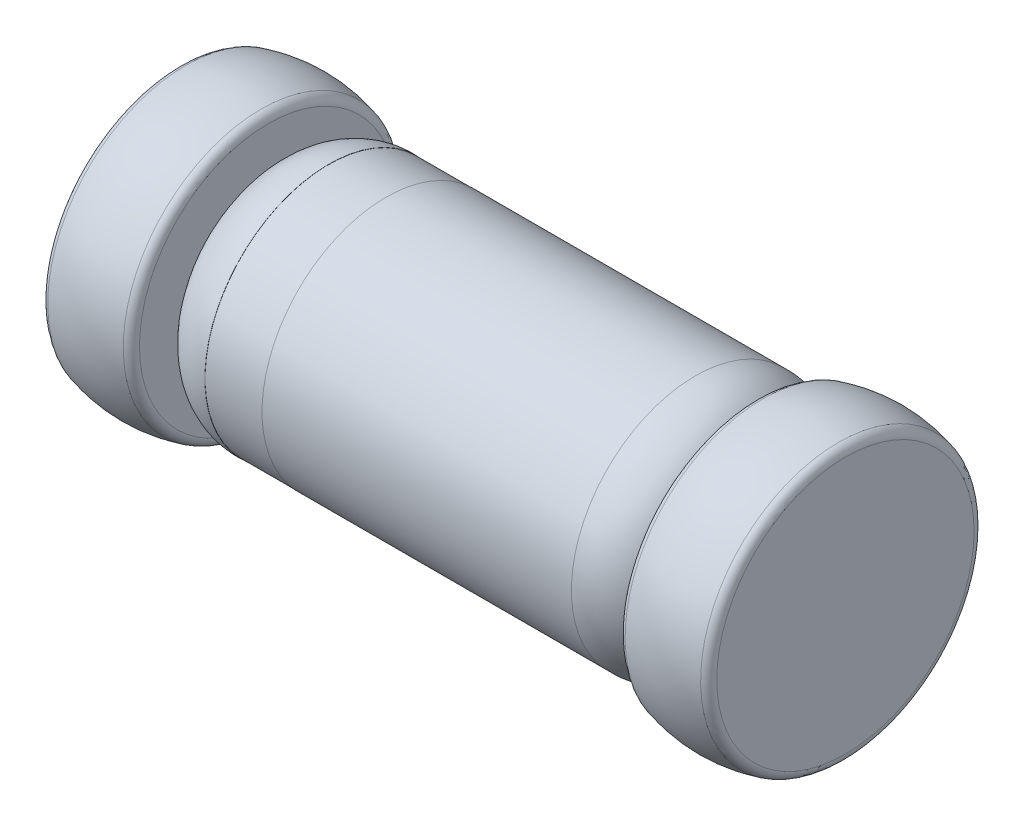
ISO-10303-21;
HEADER;
FILE_DESCRIPTION(('STEP AP214'),'2;1');
FILE_NAME('part.step','',(''),(''),'','','');
FILE_SCHEMA(('AUTOMOTIVE_DESIGN { 1 0 10303 214 1 1 1 1 }'));
ENDSEC;
DATA;
#1=APPLICATION_CONTEXT('core data for automotive mechanical design processes');
#2=APPLICATION_PROTOCOL_DEFINITION('international standard','automotive_design',2000,#1);
#3=PRODUCT_CONTEXT('',#1,'mechanical');
#4=PRODUCT('Part','Part','',(#3));
#5=PRODUCT_RELATED_PRODUCT_CATEGORY('part','',(#4));
#6=PRODUCT_DEFINITION_FORMATION('','',#4);
#7=PRODUCT_DEFINITION_CONTEXT('part definition',#1,'design');
#8=PRODUCT_DEFINITION('design','',#6,#7);
#9=PRODUCT_DEFINITION_SHAPE('','',#8);
#10=(LENGTH_UNIT() NAMED_UNIT(*) SI_UNIT(.MILLI.,.METRE.));
#11=(NAMED_UNIT(*) PLANE_ANGLE_UNIT() SI_UNIT($,.RADIAN.));
#12=(NAMED_UNIT(*) SI_UNIT($,.STERADIAN.) SOLID_ANGLE_UNIT());
#13=UNCERTAINTY_MEASURE_WITH_UNIT(LENGTH_MEASURE(1.E-05),#10,'distance_accuracy_value','');
#14=(GEOMETRIC_REPRESENTATION_CONTEXT(3) GLOBAL_UNCERTAINTY_ASSIGNED_CONTEXT((#13)) GLOBAL_UNIT_ASSIGNED_CONTEXT((#10,
#11,#12)) REPRESENTATION_CONTEXT('',''));
#15=CARTESIAN_POINT('',(0.,0.,0.));
#16=DIRECTION('',(0.,0.,1.));
#17=DIRECTION('',(1.,0.,0.));
#18=AXIS2_PLACEMENT_3D('',#15,#16,#17);
#19=CARTESIAN_POINT('',(-1.33,0.75,0.));
#20=DIRECTION('',(1.,0.,0.));
#21=DIRECTION('',(0.,0.,-1.));
#22=AXIS2_PLACEMENT_3D('',#19,#20,#21);
#23=TOROIDAL_SURFACE('',#22,0.675111101967669,0.0499999999999999);
#24=CARTESIAN_POINT('',(-1.31678571428571,0.75,0.));
#25=DIRECTION('',(1.,0.,0.));
#26=DIRECTION('',(0.,0.,-1.));
#27=AXIS2_PLACEMENT_3D('',#24,#25,#26);
#28=CIRCLE('',#27,0.723333323536788);
#29=CARTESIAN_POINT('',(-1.31678571428571,1.47333332353679,0.));
#30=VERTEX_POINT('',#29);
#31=EDGE_CURVE('E83',#30,#30,#28,.T.);
#32=ORIENTED_EDGE('',*,*,#31,.T.);
#33=EDGE_LOOP('',(#32));
#34=FACE_BOUND('',#33,.T.);
#35=CARTESIAN_POINT('',(-1.28,0.75,0.));
#36=DIRECTION('',(1.,0.,0.));
#37=DIRECTION('',(0.,0.,-1.));
#38=AXIS2_PLACEMENT_3D('',#35,#36,#37);
#39=CIRCLE('',#38,0.675111101967669);
#40=CARTESIAN_POINT('',(-1.28,0.75,-0.675111101967669));
#41=VERTEX_POINT('',#40);
#42=EDGE_CURVE('E10',#41,#41,#39,.T.);
#43=ORIENTED_EDGE('',*,*,#42,.F.);
#44=EDGE_LOOP('',(#43));
#45=FACE_BOUND('',#44,.T.);
#46=ADVANCED_FACE('F34',(#34,#45),#23,.T.);
#47=CARTESIAN_POINT('',(-1.28,1.42511110196767,0.));
#48=DIRECTION('',(1.,0.,0.));
#49=DIRECTION('',(0.,0.,-1.));
#50=AXIS2_PLACEMENT_3D('',#47,#48,#49);
#51=PLANE('',#50);
#52=ORIENTED_EDGE('',*,*,#42,.T.);
#53=EDGE_LOOP('',(#52));
#54=FACE_BOUND('',#53,.T.);
#55=CARTESIAN_POINT('',(-1.28,0.75,0.));
#56=DIRECTION('',(1.,0.,0.));
#57=DIRECTION('',(0.,0.,-1.));
#58=AXIS2_PLACEMENT_3D('',#55,#56,#57);
#59=CIRCLE('',#58,0.349999999999998);
#60=CARTESIAN_POINT('',(-1.28,0.75,-0.349999999999998));
#61=VERTEX_POINT('',#60);
#62=EDGE_CURVE('E40',#61,#61,#59,.T.);
#63=ORIENTED_EDGE('',*,*,#62,.F.);
#64=EDGE_LOOP('',(#63));
#65=FACE_BOUND('',#64,.T.);
#66=ADVANCED_FACE('F101',(#54,#65),#51,.T.);
#67=CARTESIAN_POINT('',(-0.980000507994012,0.75,0.));
#68=DIRECTION('',(1.,0.,0.));
#69=DIRECTION('',(0.,0.,-1.));
#70=AXIS2_PLACEMENT_3D('',#67,#68,#69);
#71=TOROIDAL_SURFACE('',#70,0.350552083462148,0.3);
#72=ORIENTED_EDGE('',*,*,#62,.T.);
#73=EDGE_LOOP('',(#72));
#74=FACE_BOUND('',#73,.T.);
#75=CARTESIAN_POINT('',(-0.961808606467793,0.75,0.));
#76=DIRECTION('',(1.,0.,0.));
#77=DIRECTION('',(0.,0.,-1.));
#78=AXIS2_PLACEMENT_3D('',#75,#76,#77);
#79=CIRCLE('',#78,0.65);
#80=CARTESIAN_POINT('',(-0.961808606467793,0.75,-0.65));
#81=VERTEX_POINT('',#80);
#82=EDGE_CURVE('E44',#81,#81,#79,.T.);
#83=ORIENTED_EDGE('',*,*,#82,.F.);
#84=EDGE_LOOP('',(#83));
#85=FACE_BOUND('',#84,.T.);
#86=ADVANCED_FACE('F105',(#74,#85),#71,.T.);
#87=CARTESIAN_POINT('',(-0.961808606467793,1.4,0.));
#88=DIRECTION('',(1.,0.,0.));
#89=DIRECTION('',(0.,0.,-1.));
#90=AXIS2_PLACEMENT_3D('',#87,#88,#89);
#91=PLANE('',#90);
#92=ORIENTED_EDGE('',*,*,#82,.T.);
#93=EDGE_LOOP('',(#92));
#94=FACE_BOUND('',#93,.T.);
#95=CARTESIAN_POINT('',(-0.961808606467793,0.75,0.));
#96=DIRECTION('',(1.,0.,0.));
#97=DIRECTION('',(0.,0.,-1.));
#98=AXIS2_PLACEMENT_3D('',#95,#96,#97);
#99=CIRCLE('',#98,0.649);
#100=CARTESIAN_POINT('',(-0.961808606467793,0.75,-0.649));
#101=VERTEX_POINT('',#100);
#102=EDGE_CURVE('E48',#101,#101,#99,.T.);
#103=ORIENTED_EDGE('',*,*,#102,.F.);
#104=EDGE_LOOP('',(#103));
#105=FACE_BOUND('',#104,.T.);
#106=ADVANCED_FACE('F109',(#94,#105),#91,.T.);
#107=CARTESIAN_POINT('',(1.75,0.75,0.));
#108=DIRECTION('',(1.,0.,0.));
#109=DIRECTION('',(0.,0.,-1.));
#110=AXIS2_PLACEMENT_3D('',#107,#108,#109);
#111=CYLINDRICAL_SURFACE('',#110,0.649);
#112=ORIENTED_EDGE('',*,*,#102,.T.);
#113=EDGE_LOOP('',(#112));
#114=FACE_BOUND('',#113,.T.);
#115=CARTESIAN_POINT('',(-0.661808606467793,0.75,0.));
#116=DIRECTION('',(1.,0.,0.));
#117=DIRECTION('',(0.,0.,-1.));
#118=AXIS2_PLACEMENT_3D('',#115,#116,#117);
#119=CIRCLE('',#118,0.649);
#120=CARTESIAN_POINT('',(-0.661808606467793,0.75,-0.649));
#121=VERTEX_POINT('',#120);
#122=EDGE_CURVE('E53',#121,#121,#119,.T.);
#123=ORIENTED_EDGE('',*,*,#122,.F.);
#124=EDGE_LOOP('',(#123));
#125=FACE_BOUND('',#124,.T.);
#126=ADVANCED_FACE('F115',(#114,#125),#111,.T.);
#127=CARTESIAN_POINT('',(-0.661808606467793,1.399,0.));
#128=DIRECTION('',(-1.,0.,0.));
#129=DIRECTION('',(0.,0.,1.));
#130=AXIS2_PLACEMENT_3D('',#127,#128,#129);
#131=PLANE('',#130);
#132=ORIENTED_EDGE('',*,*,#122,.T.);
#133=EDGE_LOOP('',(#132));
#134=FACE_BOUND('',#133,.T.);
#135=CARTESIAN_POINT('',(-0.661808606467793,0.75,0.));
#136=DIRECTION('',(1.,0.,0.));
#137=DIRECTION('',(0.,0.,-1.));
#138=AXIS2_PLACEMENT_3D('',#135,#136,#137);
#139=CIRCLE('',#138,0.65);
#140=CARTESIAN_POINT('',(-0.661808606467793,0.75,-0.65));
#141=VERTEX_POINT('',#140);
#142=EDGE_CURVE('E56',#141,#141,#139,.T.);
#143=ORIENTED_EDGE('',*,*,#142,.F.);
#144=EDGE_LOOP('',(#143));
#145=FACE_BOUND('',#144,.T.);
#146=ADVANCED_FACE('F119',(#134,#145),#131,.T.);
#147=CARTESIAN_POINT('',(1.75,0.75,0.));
#148=DIRECTION('',(1.,0.,0.));
#149=DIRECTION('',(0.,0.,-1.));
#150=AXIS2_PLACEMENT_3D('',#147,#148,#149);
#151=CYLINDRICAL_SURFACE('',#150,0.65);
#152=ORIENTED_EDGE('',*,*,#142,.T.);
#153=EDGE_LOOP('',(#152));
#154=FACE_BOUND('',#153,.T.);
#155=CARTESIAN_POINT('',(0.961808606467793,0.75,0.));
#156=DIRECTION('',(1.,0.,0.));
#157=DIRECTION('',(0.,0.,-1.));
#158=AXIS2_PLACEMENT_3D('',#155,#156,#157);
#159=CIRCLE('',#158,0.65);
#160=CARTESIAN_POINT('',(0.961808606467793,0.75,-0.65));
#161=VERTEX_POINT('',#160);
#162=EDGE_CURVE('E59',#161,#161,#159,.T.);
#163=ORIENTED_EDGE('',*,*,#162,.F.);
#164=EDGE_LOOP('',(#163));
#165=FACE_BOUND('',#164,.T.);
#166=ADVANCED_FACE('F123',(#154,#165),#151,.T.);
#167=CARTESIAN_POINT('',(0.980000507994012,0.75,0.));
#168=DIRECTION('',(1.,0.,0.));
#169=DIRECTION('',(0.,0.,-1.));
#170=AXIS2_PLACEMENT_3D('',#167,#168,#169);
#171=TOROIDAL_SURFACE('',#170,0.350552083462148,0.3);
#172=ORIENTED_EDGE('',*,*,#162,.T.);
#173=EDGE_LOOP('',(#172));
#174=FACE_BOUND('',#173,.T.);
#175=CARTESIAN_POINT('',(1.28,0.75,0.));
#176=DIRECTION('',(1.,0.,0.));
#177=DIRECTION('',(0.,0.,-1.));
#178=AXIS2_PLACEMENT_3D('',#175,#176,#177);
#179=CIRCLE('',#178,0.349999999999998);
#180=CARTESIAN_POINT('',(1.28,0.75,-0.349999999999998));
#181=VERTEX_POINT('',#180);
#182=EDGE_CURVE('E62',#181,#181,#179,.T.);
#183=ORIENTED_EDGE('',*,*,#182,.F.);
#184=EDGE_LOOP('',(#183));
#185=FACE_BOUND('',#184,.T.);
#186=ADVANCED_FACE('F127',(#174,#185),#171,.T.);
#187=CARTESIAN_POINT('',(1.28,1.42511110196767,0.));
#188=DIRECTION('',(-1.,0.,0.));
#189=DIRECTION('',(0.,0.,1.));
#190=AXIS2_PLACEMENT_3D('',#187,#188,#189);
#191=PLANE('',#190);
#192=ORIENTED_EDGE('',*,*,#182,.T.);
#193=EDGE_LOOP('',(#192));
#194=FACE_BOUND('',#193,.T.);
#195=CARTESIAN_POINT('',(1.28,0.75,0.));
#196=DIRECTION('',(1.,0.,0.));
#197=DIRECTION('',(0.,0.,-1.));
#198=AXIS2_PLACEMENT_3D('',#195,#196,#197);
#199=CIRCLE('',#198,0.675111101967669);
#200=CARTESIAN_POINT('',(1.28,0.75,-0.675111101967669));
#201=VERTEX_POINT('',#200);
#202=EDGE_CURVE('E65',#201,#201,#199,.T.);
#203=ORIENTED_EDGE('',*,*,#202,.F.);
#204=EDGE_LOOP('',(#203));
#205=FACE_BOUND('',#204,.T.);
#206=ADVANCED_FACE('F131',(#194,#205),#191,.T.);
#207=CARTESIAN_POINT('',(1.33,0.75,0.));
#208=DIRECTION('',(1.,0.,0.));
#209=DIRECTION('',(0.,0.,-1.));
#210=AXIS2_PLACEMENT_3D('',#207,#208,#209);
#211=TOROIDAL_SURFACE('',#210,0.675111101967669,0.0499999999999999);
#212=ORIENTED_EDGE('',*,*,#202,.T.);
#213=EDGE_LOOP('',(#212));
#214=FACE_BOUND('',#213,.T.);
#215=CARTESIAN_POINT('',(1.31678571428571,0.75,0.));
#216=DIRECTION('',(1.,0.,0.));
#217=DIRECTION('',(0.,0.,-1.));
#218=AXIS2_PLACEMENT_3D('',#215,#216,#217);
#219=CIRCLE('',#218,0.723333323536788);
#220=CARTESIAN_POINT('',(1.31678571428571,1.47333332353679,0.));
#221=VERTEX_POINT('',#220);
#222=EDGE_CURVE('E68',#221,#221,#219,.T.);
#223=ORIENTED_EDGE('',*,*,#222,.F.);
#224=EDGE_LOOP('',(#223));
#225=FACE_BOUND('',#224,.T.);
#226=ADVANCED_FACE('F135',(#214,#225),#211,.T.);
#227=CARTESIAN_POINT('',(1.515,0.75,0.));
#228=DIRECTION('',(1.,0.,0.));
#229=DIRECTION('',(0.,1.,0.));
#230=AXIS2_PLACEMENT_3D('',#227,#228,#229);
#231=SPHERICAL_SURFACE('',#230,0.75);
#232=CARTESIAN_POINT('',(1.71321428571429,0.75,0.));
#233=DIRECTION('',(1.,0.,0.));
#234=DIRECTION('',(0.,0.,-1.));
#235=AXIS2_PLACEMENT_3D('',#232,#233,#234);
#236=CIRCLE('',#235,0.723333323536788);
#237=CARTESIAN_POINT('',(1.71321428571429,1.47333332353679,0.));
#238=VERTEX_POINT('',#237);
#239=EDGE_CURVE('E71',#238,#238,#236,.T.);
#240=CARTESIAN_POINT('',(1.31678571428571,1.47333332353679,0.));
#241=CARTESIAN_POINT('',(1.32081623561858,1.47443780678074,0.));
#242=CARTESIAN_POINT('',(1.32485599016493,1.47550859534375,0.));
#243=CARTESIAN_POINT('',(1.33295283302281,1.477582498808,0.));
#244=CARTESIAN_POINT('',(1.33700992133435,1.47858561370924,0.));
#245=CARTESIAN_POINT('',(1.34514029906079,1.4805238855501,0.));
#246=CARTESIAN_POINT('',(1.3492135884757,1.48145904248971,0.));
#247=CARTESIAN_POINT('',(1.35737522992211,1.48326113816415,0.));
#248=CARTESIAN_POINT('',(1.36146358195362,1.48412807689896,0.));
#249=CARTESIAN_POINT('',(1.36965420628522,1.48579349362538,0.));
#250=CARTESIAN_POINT('',(1.37375647858531,1.48659197161698,0.));
#251=CARTESIAN_POINT('',(1.3819737971231,1.48812024381253,0.));
#252=CARTESIAN_POINT('',(1.38608884336079,1.48885003801649,0.));
#253=CARTESIAN_POINT('',(1.3943305598983,1.49024073868738,0.));
#254=CARTESIAN_POINT('',(1.39845723019812,1.49090164515433,0.));
#255=CARTESIAN_POINT('',(1.40672104172956,1.49215438567747,0.));
#256=CARTESIAN_POINT('',(1.41085818296118,1.49274621973368,0.));
#257=CARTESIAN_POINT('',(1.41914178030178,1.49386065005577,0.));
#258=CARTESIAN_POINT('',(1.42328823641075,1.49438324632164,0.));
#259=CARTESIAN_POINT('',(1.43158930484824,1.49535905503269,0.));
#260=CARTESIAN_POINT('',(1.43574391717676,1.49581226747786,0.));
#261=CARTESIAN_POINT('',(1.44406013711651,1.49664918190476,0.));
#262=CARTESIAN_POINT('',(1.44822174472775,1.49703288388648,0.));
#263=CARTESIAN_POINT('',(1.4565507923414,1.49773067016743,0.));
#264=CARTESIAN_POINT('',(1.46071823234381,1.49804475446666,0.));
#265=CARTESIAN_POINT('',(1.46905778021848,1.49860321761699,0.));
#266=CARTESIAN_POINT('',(1.47322988809075,1.4988475964681,0.));
#267=CARTESIAN_POINT('',(1.48157760587947,1.49926658043464,0.));
#268=CARTESIAN_POINT('',(1.48575321579592,1.49944118555006,0.));
#269=CARTESIAN_POINT('',(1.49410677086875,1.49972057325475,0.));
#270=CARTESIAN_POINT('',(1.49828471602513,1.49982535584401,0.));
#271=CARTESIAN_POINT('',(1.506641774121,1.49996506921664,0.));
#272=CARTESIAN_POINT('',(1.5108208870605,1.5,0.));
#273=CARTESIAN_POINT('',(1.5191791129395,1.5,0.));
#274=CARTESIAN_POINT('',(1.523358225879,1.49996506921664,0.));
#275=CARTESIAN_POINT('',(1.53171528397487,1.49982535584401,0.));
#276=CARTESIAN_POINT('',(1.53589322913125,1.49972057325475,0.));
#277=CARTESIAN_POINT('',(1.54424678420408,1.49944118555006,0.));
#278=CARTESIAN_POINT('',(1.54842239412053,1.49926658043464,0.));
#279=CARTESIAN_POINT('',(1.55677011190925,1.4988475964681,0.));
#280=CARTESIAN_POINT('',(1.56094221978152,1.49860321761699,0.));
#281=CARTESIAN_POINT('',(1.56928176765619,1.49804475446666,0.));
#282=CARTESIAN_POINT('',(1.5734492076586,1.49773067016743,0.));
#283=CARTESIAN_POINT('',(1.58177825527225,1.49703288388648,0.));
#284=CARTESIAN_POINT('',(1.58593986288349,1.49664918190476,0.));
#285=CARTESIAN_POINT('',(1.59425608282324,1.49581226747786,0.));
#286=CARTESIAN_POINT('',(1.59841069515176,1.49535905503269,0.));
#287=CARTESIAN_POINT('',(1.60671176358925,1.49438324632164,0.));
#288=CARTESIAN_POINT('',(1.61085821969822,1.49386065005577,0.));
#289=CARTESIAN_POINT('',(1.61914181703882,1.49274621973368,0.));
#290=CARTESIAN_POINT('',(1.62327895827044,1.49215438567748,0.));
#291=CARTESIAN_POINT('',(1.63154276980188,1.49090164515433,0.));
#292=CARTESIAN_POINT('',(1.6356694401017,1.49024073868738,0.));
#293=CARTESIAN_POINT('',(1.64391115663921,1.48885003801649,0.));
#294=CARTESIAN_POINT('',(1.6480262028769,1.48812024381253,0.));
#295=CARTESIAN_POINT('',(1.65624352141469,1.48659197161698,0.));
#296=CARTESIAN_POINT('',(1.66034579371478,1.48579349362538,0.));
#297=CARTESIAN_POINT('',(1.66853641804638,1.48412807689896,0.));
#298=CARTESIAN_POINT('',(1.67262477007789,1.48326113816415,0.));
#299=CARTESIAN_POINT('',(1.6807864115243,1.48145904248971,0.));
#300=CARTESIAN_POINT('',(1.68485970093921,1.4805238855501,0.));
#301=CARTESIAN_POINT('',(1.69299007866565,1.47858561370924,0.));
#302=CARTESIAN_POINT('',(1.69704716697719,1.477582498808,0.));
#303=CARTESIAN_POINT('',(1.70514400983507,1.47550859534375,0.));
#304=CARTESIAN_POINT('',(1.70918376438142,1.47443780678074,0.));
#305=CARTESIAN_POINT('',(1.71321428571429,1.47333332353679,0.));
#306=B_SPLINE_CURVE_WITH_KNOTS('',3,(#240,#241,#242,#243,#244,#245,#246,#247,#248,#249,#250,
#251,#252,#253,#254,#255,#256,#257,#258,#259,#260,#261,#262,#263,#264,#265,#266,#267,#268,#269,
#270,#271,#272,#273,#274,#275,#276,#277,#278,#279,#280,#281,#282,#283,#284,#285,#286,#287,#288,
#289,#290,#291,#292,#293,#294,#295,#296,#297,#298,#299,#300,#301,#302,#303,#304,#305),
.UNSPECIFIED.,.F.,.F.,(4,2,2,2,2,2,2,2,2,2,2,2,2,2,2,2,2,2,2,2,2,2,2,2,2,2,2,2,2,2,2,2,4),(0.,
0.0125371928481531,0.0250743856963063,0.0376115785444596,0.050148771392613,0.0626859642407662,
0.0752231570889195,0.0877603499370726,0.100297542785226,0.112834735633379,0.125371928481532,
0.137909121329686,0.150446314177839,0.162983507025992,0.175520699874146,0.188057892722299,
0.200595085570452,0.213132278418605,0.225669471266759,0.238206664114912,0.250743856963065,
0.263281049811218,0.275818242659372,0.288355435507525,0.300892628355678,0.313429821203831,
0.325967014051985,0.338504206900138,0.351041399748291,0.363578592596444,0.376115785444598,
0.388652978292751,0.401190171140904),.UNSPECIFIED.);
#307=EDGE_CURVE('BSEAM139',#221,#238,#306,.T.);
#308=ORIENTED_EDGE('',*,*,#222,.T.);
#309=ORIENTED_EDGE('',*,*,#239,.F.);
#310=ORIENTED_EDGE('',*,*,#307,.T.);
#311=ORIENTED_EDGE('',*,*,#307,.F.);
#312=EDGE_LOOP('',(#308,#310,#309,#311));
#313=FACE_BOUND('',#312,.T.);
#314=ADVANCED_FACE('F139',(#313),#231,.T.);
#315=CARTESIAN_POINT('',(1.7,0.75,0.));
#316=DIRECTION('',(1.,0.,0.));
#317=DIRECTION('',(0.,0.,-1.));
#318=AXIS2_PLACEMENT_3D('',#315,#316,#317);
#319=TOROIDAL_SURFACE('',#318,0.675111101967669,0.05);
#320=ORIENTED_EDGE('',*,*,#239,.T.);
#321=EDGE_LOOP('',(#320));
#322=FACE_BOUND('',#321,.T.);
#323=CARTESIAN_POINT('',(1.75,0.75,0.));
#324=DIRECTION('',(1.,0.,0.));
#325=DIRECTION('',(0.,0.,-1.));
#326=AXIS2_PLACEMENT_3D('',#323,#324,#325);
#327=CIRCLE('',#326,0.675111101967669);
#328=CARTESIAN_POINT('',(1.75,0.75,-0.675111101967669));
#329=VERTEX_POINT('',#328);
#330=EDGE_CURVE('E74',#329,#329,#327,.T.);
#331=ORIENTED_EDGE('',*,*,#330,.F.);
#332=EDGE_LOOP('',(#331));
#333=FACE_BOUND('',#332,.T.);
#334=ADVANCED_FACE('F143',(#322,#333),#319,.T.);
#335=CARTESIAN_POINT('',(1.75,0.75,0.));
#336=DIRECTION('',(1.,0.,0.));
#337=DIRECTION('',(0.,0.,-1.));
#338=AXIS2_PLACEMENT_3D('',#335,#336,#337);
#339=PLANE('',#338);
#340=ORIENTED_EDGE('',*,*,#330,.T.);
#341=EDGE_LOOP('',(#340));
#342=FACE_BOUND('',#341,.T.);
#343=ADVANCED_FACE('F147',(#342),#339,.T.);
#344=CARTESIAN_POINT('',(-1.75,0.75,0.));
#345=DIRECTION('',(-1.,0.,0.));
#346=DIRECTION('',(0.,0.,1.));
#347=AXIS2_PLACEMENT_3D('',#344,#345,#346);
#348=PLANE('',#347);
#349=CARTESIAN_POINT('',(-1.75,0.75,0.));
#350=DIRECTION('',(1.,0.,0.));
#351=DIRECTION('',(0.,0.,-1.));
#352=AXIS2_PLACEMENT_3D('',#349,#350,#351);
#353=CIRCLE('',#352,0.675111101967669);
#354=CARTESIAN_POINT('',(-1.75,0.75,-0.675111101967669));
#355=VERTEX_POINT('',#354);
#356=EDGE_CURVE('E77',#355,#355,#353,.T.);
#357=ORIENTED_EDGE('',*,*,#356,.F.);
#358=EDGE_LOOP('',(#357));
#359=FACE_BOUND('',#358,.T.);
#360=ADVANCED_FACE('F97',(#359),#348,.T.);
#361=CARTESIAN_POINT('',(-1.7,0.75,0.));
#362=DIRECTION('',(1.,0.,0.));
#363=DIRECTION('',(0.,0.,-1.));
#364=AXIS2_PLACEMENT_3D('',#361,#362,#363);
#365=TOROIDAL_SURFACE('',#364,0.675111101967669,0.05);
#366=ORIENTED_EDGE('',*,*,#356,.T.);
#367=EDGE_LOOP('',(#366));
#368=FACE_BOUND('',#367,.T.);
#369=CARTESIAN_POINT('',(-1.71321428571429,0.75,0.));
#370=DIRECTION('',(1.,0.,0.));
#371=DIRECTION('',(0.,0.,-1.));
#372=AXIS2_PLACEMENT_3D('',#369,#370,#371);
#373=CIRCLE('',#372,0.723333323536788);
#374=CARTESIAN_POINT('',(-1.71321428571429,1.47333332353679,0.));
#375=VERTEX_POINT('',#374);
#376=EDGE_CURVE('E80',#375,#375,#373,.T.);
#377=ORIENTED_EDGE('',*,*,#376,.F.);
#378=EDGE_LOOP('',(#377));
#379=FACE_BOUND('',#378,.T.);
#380=ADVANCED_FACE('F91',(#368,#379),#365,.T.);
#381=CARTESIAN_POINT('',(-1.515,0.75,0.));
#382=DIRECTION('',(1.,0.,0.));
#383=DIRECTION('',(0.,1.,0.));
#384=AXIS2_PLACEMENT_3D('',#381,#382,#383);
#385=SPHERICAL_SURFACE('',#384,0.75);
#386=CARTESIAN_POINT('',(-1.71321428571429,1.47333332353679,0.));
#387=CARTESIAN_POINT('',(-1.70918376438142,1.47443780678074,0.));
#388=CARTESIAN_POINT('',(-1.70514400983507,1.47550859534375,0.));
#389=CARTESIAN_POINT('',(-1.69704716697719,1.477582498808,0.));
#390=CARTESIAN_POINT('',(-1.69299007866565,1.47858561370924,0.));
#391=CARTESIAN_POINT('',(-1.68485970093921,1.4805238855501,0.));
#392=CARTESIAN_POINT('',(-1.6807864115243,1.48145904248971,0.));
#393=CARTESIAN_POINT('',(-1.67262477007789,1.48326113816415,0.));
#394=CARTESIAN_POINT('',(-1.66853641804638,1.48412807689896,0.));
#395=CARTESIAN_POINT('',(-1.66034579371478,1.48579349362538,0.));
#396=CARTESIAN_POINT('',(-1.65624352141469,1.48659197161698,0.));
#397=CARTESIAN_POINT('',(-1.6480262028769,1.48812024381253,0.));
#398=CARTESIAN_POINT('',(-1.64391115663921,1.48885003801649,0.));
#399=CARTESIAN_POINT('',(-1.6356694401017,1.49024073868738,0.));
#400=CARTESIAN_POINT('',(-1.63154276980188,1.49090164515433,0.));
#401=CARTESIAN_POINT('',(-1.62327895827044,1.49215438567748,0.));
#402=CARTESIAN_POINT('',(-1.61914181703882,1.49274621973368,0.));
#403=CARTESIAN_POINT('',(-1.61085821969822,1.49386065005577,0.));
#404=CARTESIAN_POINT('',(-1.60671176358925,1.49438324632164,0.));
#405=CARTESIAN_POINT('',(-1.59841069515176,1.49535905503269,0.));
#406=CARTESIAN_POINT('',(-1.59425608282324,1.49581226747786,0.));
#407=CARTESIAN_POINT('',(-1.58593986288349,1.49664918190476,0.));
#408=CARTESIAN_POINT('',(-1.58177825527225,1.49703288388648,0.));
#409=CARTESIAN_POINT('',(-1.5734492076586,1.49773067016743,0.));
#410=CARTESIAN_POINT('',(-1.56928176765619,1.49804475446666,0.));
#411=CARTESIAN_POINT('',(-1.56094221978152,1.49860321761699,0.));
#412=CARTESIAN_POINT('',(-1.55677011190925,1.4988475964681,0.));
#413=CARTESIAN_POINT('',(-1.54842239412053,1.49926658043464,0.));
#414=CARTESIAN_POINT('',(-1.54424678420408,1.49944118555006,0.));
#415=CARTESIAN_POINT('',(-1.53589322913125,1.49972057325475,0.));
#416=CARTESIAN_POINT('',(-1.53171528397487,1.49982535584401,0.));
#417=CARTESIAN_POINT('',(-1.523358225879,1.49996506921664,0.));
#418=CARTESIAN_POINT('',(-1.5191791129395,1.5,0.));
#419=CARTESIAN_POINT('',(-1.5108208870605,1.5,0.));
#420=CARTESIAN_POINT('',(-1.506641774121,1.49996506921664,0.));
#421=CARTESIAN_POINT('',(-1.49828471602513,1.49982535584401,0.));
#422=CARTESIAN_POINT('',(-1.49410677086875,1.49972057325475,0.));
#423=CARTESIAN_POINT('',(-1.48575321579592,1.49944118555006,0.));
#424=CARTESIAN_POINT('',(-1.48157760587947,1.49926658043464,0.));
#425=CARTESIAN_POINT('',(-1.47322988809075,1.4988475964681,0.));
#426=CARTESIAN_POINT('',(-1.46905778021848,1.49860321761699,0.));
#427=CARTESIAN_POINT('',(-1.46071823234381,1.49804475446666,0.));
#428=CARTESIAN_POINT('',(-1.4565507923414,1.49773067016743,0.));
#429=CARTESIAN_POINT('',(-1.44822174472775,1.49703288388648,0.));
#430=CARTESIAN_POINT('',(-1.44406013711651,1.49664918190476,0.));
#431=CARTESIAN_POINT('',(-1.43574391717676,1.49581226747786,0.));
#432=CARTESIAN_POINT('',(-1.43158930484824,1.49535905503269,0.));
#433=CARTESIAN_POINT('',(-1.42328823641075,1.49438324632164,0.));
#434=CARTESIAN_POINT('',(-1.41914178030178,1.49386065005577,0.));
#435=CARTESIAN_POINT('',(-1.41085818296118,1.49274621973368,0.));
#436=CARTESIAN_POINT('',(-1.40672104172956,1.49215438567748,0.));
#437=CARTESIAN_POINT('',(-1.39845723019812,1.49090164515433,0.));
#438=CARTESIAN_POINT('',(-1.3943305598983,1.49024073868738,0.));
#439=CARTESIAN_POINT('',(-1.38608884336079,1.48885003801649,0.));
#440=CARTESIAN_POINT('',(-1.3819737971231,1.48812024381253,0.));
#441=CARTESIAN_POINT('',(-1.37375647858531,1.48659197161698,0.));
#442=CARTESIAN_POINT('',(-1.36965420628522,1.48579349362538,0.));
#443=CARTESIAN_POINT('',(-1.36146358195362,1.48412807689896,0.));
#444=CARTESIAN_POINT('',(-1.35737522992211,1.48326113816415,0.));
#445=CARTESIAN_POINT('',(-1.3492135884757,1.48145904248971,0.));
#446=CARTESIAN_POINT('',(-1.34514029906079,1.4805238855501,0.));
#447=CARTESIAN_POINT('',(-1.33700992133435,1.47858561370924,0.));
#448=CARTESIAN_POINT('',(-1.33295283302281,1.477582498808,0.));
#449=CARTESIAN_POINT('',(-1.32485599016493,1.47550859534375,0.));
#450=CARTESIAN_POINT('',(-1.32081623561858,1.47443780678074,0.));
#451=CARTESIAN_POINT('',(-1.31678571428571,1.47333332353679,0.));
#452=B_SPLINE_CURVE_WITH_KNOTS('',3,(#386,#387,#388,#389,#390,#391,#392,#393,#394,#395,#396,
#397,#398,#399,#400,#401,#402,#403,#404,#405,#406,#407,#408,#409,#410,#411,#412,#413,#414,#415,
#416,#417,#418,#419,#420,#421,#422,#423,#424,#425,#426,#427,#428,#429,#430,#431,#432,#433,#434,
#435,#436,#437,#438,#439,#440,#441,#442,#443,#444,#445,#446,#447,#448,#449,#450,#451),
.UNSPECIFIED.,.F.,.F.,(4,2,2,2,2,2,2,2,2,2,2,2,2,2,2,2,2,2,2,2,2,2,2,2,2,2,2,2,2,2,2,2,4),(0.,
0.0125371928481531,0.0250743856963065,0.0376115785444598,0.050148771392613,0.0626859642407662,
0.0752231570889195,0.0877603499370727,0.100297542785226,0.112834735633379,0.125371928481532,
0.137909121329686,0.150446314177839,0.162983507025992,0.175520699874146,0.188057892722299,
0.200595085570452,0.213132278418605,0.225669471266759,0.238206664114912,0.250743856963065,
0.263281049811218,0.275818242659372,0.288355435507525,0.300892628355678,0.313429821203831,
0.325967014051985,0.338504206900138,0.351041399748291,0.363578592596444,0.376115785444598,
0.388652978292751,0.401190171140904),.UNSPECIFIED.);
#453=EDGE_CURVE('BSEAM89',#375,#30,#452,.T.);
#454=ORIENTED_EDGE('',*,*,#376,.T.);
#455=ORIENTED_EDGE('',*,*,#31,.F.);
#456=ORIENTED_EDGE('',*,*,#453,.T.);
#457=ORIENTED_EDGE('',*,*,#453,.F.);
#458=EDGE_LOOP('',(#454,#456,#455,#457));
#459=FACE_BOUND('',#458,.T.);
#460=ADVANCED_FACE('F89',(#459),#385,.T.);
#461=CLOSED_SHELL('',(#46,#66,#86,#106,#126,#146,#166,#186,#206,#226,#314,#334,#343,#360,#380,#460));
#462=MANIFOLD_SOLID_BREP('B2',#461);
#463=ADVANCED_BREP_SHAPE_REPRESENTATION('',(#18,#462),#14);
#464=SHAPE_DEFINITION_REPRESENTATION(#9,#463);
ENDSEC;
END-ISO-10303-21;
